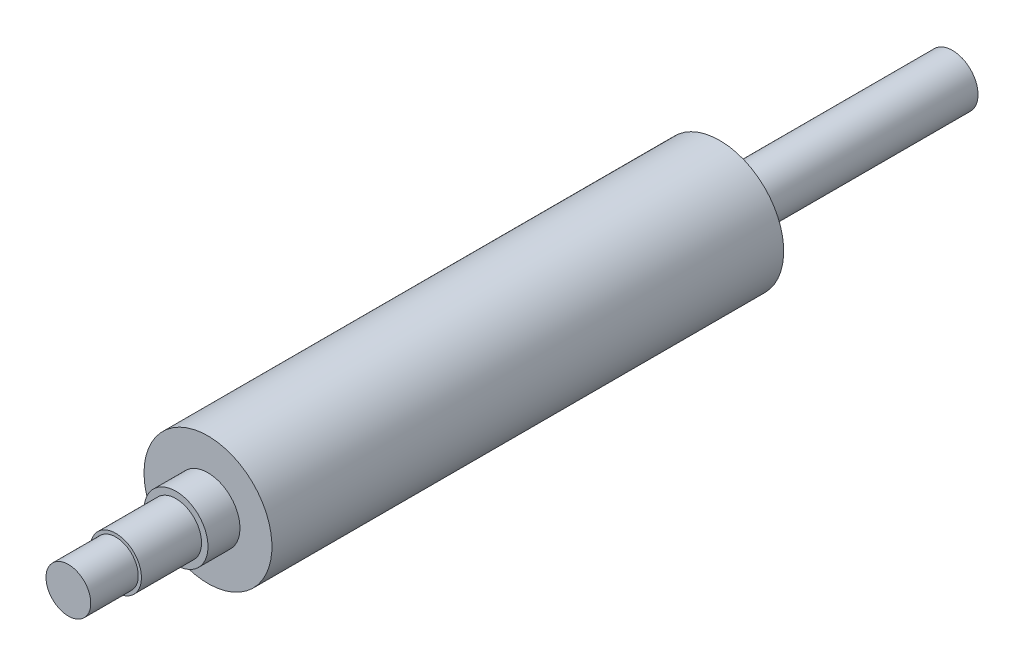
ISO-10303-21;
HEADER;
FILE_DESCRIPTION(('STEP AP214'),'2;1');
FILE_NAME('part.step','',(''),(''),'','','');
FILE_SCHEMA(('AUTOMOTIVE_DESIGN { 1 0 10303 214 1 1 1 1 }'));
ENDSEC;
DATA;
#1=APPLICATION_CONTEXT('core data for automotive mechanical design processes');
#2=APPLICATION_PROTOCOL_DEFINITION('international standard','automotive_design',2000,#1);
#3=PRODUCT_CONTEXT('',#1,'mechanical');
#4=PRODUCT('Part','Part','',(#3));
#5=PRODUCT_RELATED_PRODUCT_CATEGORY('part','',(#4));
#6=PRODUCT_DEFINITION_FORMATION('','',#4);
#7=PRODUCT_DEFINITION_CONTEXT('part definition',#1,'design');
#8=PRODUCT_DEFINITION('design','',#6,#7);
#9=PRODUCT_DEFINITION_SHAPE('','',#8);
#10=(LENGTH_UNIT() NAMED_UNIT(*) SI_UNIT(.MILLI.,.METRE.));
#11=(NAMED_UNIT(*) PLANE_ANGLE_UNIT() SI_UNIT($,.RADIAN.));
#12=(NAMED_UNIT(*) SI_UNIT($,.STERADIAN.) SOLID_ANGLE_UNIT());
#13=UNCERTAINTY_MEASURE_WITH_UNIT(LENGTH_MEASURE(1.E-05),#10,'distance_accuracy_value','');
#14=(GEOMETRIC_REPRESENTATION_CONTEXT(3) GLOBAL_UNCERTAINTY_ASSIGNED_CONTEXT((#13)) GLOBAL_UNIT_ASSIGNED_CONTEXT((#10,
#11,#12)) REPRESENTATION_CONTEXT('',''));
#15=CARTESIAN_POINT('',(0.,0.,0.));
#16=DIRECTION('',(0.,0.,1.));
#17=DIRECTION('',(1.,0.,0.));
#18=AXIS2_PLACEMENT_3D('',#15,#16,#17);
#19=CARTESIAN_POINT('',(4.,0.,0.));
#20=DIRECTION('',(0.,0.,1.));
#21=DIRECTION('',(1.,0.,0.));
#22=AXIS2_PLACEMENT_3D('',#19,#20,#21);
#23=PLANE('',#22);
#24=CARTESIAN_POINT('',(0.,0.,0.));
#25=DIRECTION('',(0.,0.,-1.));
#26=DIRECTION('',(-1.,0.,0.));
#27=AXIS2_PLACEMENT_3D('',#24,#25,#26);
#28=CIRCLE('',#27,4.);
#29=CARTESIAN_POINT('',(-4.,0.,0.));
#30=VERTEX_POINT('',#29);
#31=EDGE_CURVE('E88',#30,#30,#28,.T.);
#32=ORIENTED_EDGE('',*,*,#31,.T.);
#33=EDGE_LOOP('',(#32));
#34=FACE_BOUND('',#33,.T.);
#35=ADVANCED_FACE('F37',(#34),#23,.F.);
#36=CARTESIAN_POINT('',(0.,0.,138.2));
#37=DIRECTION('',(0.,0.,-1.));
#38=DIRECTION('',(-1.,0.,0.));
#39=AXIS2_PLACEMENT_3D('',#36,#37,#38);
#40=PLANE('',#39);
#41=CARTESIAN_POINT('',(0.,0.,138.2));
#42=DIRECTION('',(0.,0.,-1.));
#43=DIRECTION('',(-1.,0.,0.));
#44=AXIS2_PLACEMENT_3D('',#41,#42,#43);
#45=CIRCLE('',#44,3.50000000000002);
#46=CARTESIAN_POINT('',(-3.50000000000002,0.,138.2));
#47=VERTEX_POINT('',#46);
#48=EDGE_CURVE('E10',#47,#47,#45,.T.);
#49=ORIENTED_EDGE('',*,*,#48,.F.);
#50=EDGE_LOOP('',(#49));
#51=FACE_BOUND('',#50,.T.);
#52=ADVANCED_FACE('F155',(#51),#40,.F.);
#53=CARTESIAN_POINT('',(0.,0.,0.));
#54=DIRECTION('',(0.,0.,-1.));
#55=DIRECTION('',(-1.,0.,0.));
#56=AXIS2_PLACEMENT_3D('',#53,#54,#55);
#57=CYLINDRICAL_SURFACE('',#56,3.50000000000002);
#58=CARTESIAN_POINT('',(0.,0.,130.78));
#59=DIRECTION('',(0.,0.,-1.));
#60=DIRECTION('',(-1.,0.,0.));
#61=AXIS2_PLACEMENT_3D('',#58,#59,#60);
#62=CIRCLE('',#61,3.50000000000002);
#63=CARTESIAN_POINT('',(-3.50000000000002,0.,130.78));
#64=VERTEX_POINT('',#63);
#65=EDGE_CURVE('E44',#64,#64,#62,.T.);
#66=ORIENTED_EDGE('',*,*,#65,.F.);
#67=EDGE_LOOP('',(#66));
#68=FACE_BOUND('',#67,.T.);
#69=ORIENTED_EDGE('',*,*,#48,.T.);
#70=EDGE_LOOP('',(#69));
#71=FACE_BOUND('',#70,.T.);
#72=ADVANCED_FACE('F150',(#68,#71),#57,.T.);
#73=CARTESIAN_POINT('',(3.50000000000002,0.,130.78));
#74=DIRECTION('',(0.,0.,-1.));
#75=DIRECTION('',(-1.,0.,0.));
#76=AXIS2_PLACEMENT_3D('',#73,#74,#75);
#77=PLANE('',#76);
#78=CARTESIAN_POINT('',(0.,0.,130.78));
#79=DIRECTION('',(0.,0.,-1.));
#80=DIRECTION('',(-1.,0.,0.));
#81=AXIS2_PLACEMENT_3D('',#78,#79,#80);
#82=CIRCLE('',#81,4.00000000000002);
#83=CARTESIAN_POINT('',(-4.00000000000002,0.,130.78));
#84=VERTEX_POINT('',#83);
#85=EDGE_CURVE('E49',#84,#84,#82,.T.);
#86=ORIENTED_EDGE('',*,*,#85,.F.);
#87=EDGE_LOOP('',(#86));
#88=FACE_BOUND('',#87,.T.);
#89=ORIENTED_EDGE('',*,*,#65,.T.);
#90=EDGE_LOOP('',(#89));
#91=FACE_BOUND('',#90,.T.);
#92=ADVANCED_FACE('F145',(#88,#91),#77,.F.);
#93=CARTESIAN_POINT('',(0.,0.,0.));
#94=DIRECTION('',(0.,0.,-1.));
#95=DIRECTION('',(-1.,0.,0.));
#96=AXIS2_PLACEMENT_3D('',#93,#94,#95);
#97=CYLINDRICAL_SURFACE('',#96,4.00000000000002);
#98=CARTESIAN_POINT('',(0.,0.,121.38));
#99=DIRECTION('',(0.,0.,-1.));
#100=DIRECTION('',(-1.,0.,0.));
#101=AXIS2_PLACEMENT_3D('',#98,#99,#100);
#102=CIRCLE('',#101,4.00000000000002);
#103=CARTESIAN_POINT('',(-4.00000000000002,0.,121.38));
#104=VERTEX_POINT('',#103);
#105=EDGE_CURVE('E54',#104,#104,#102,.T.);
#106=ORIENTED_EDGE('',*,*,#105,.F.);
#107=EDGE_LOOP('',(#106));
#108=FACE_BOUND('',#107,.T.);
#109=ORIENTED_EDGE('',*,*,#85,.T.);
#110=EDGE_LOOP('',(#109));
#111=FACE_BOUND('',#110,.T.);
#112=ADVANCED_FACE('F139',(#108,#111),#97,.T.);
#113=CARTESIAN_POINT('',(4.00000000000002,0.,121.38));
#114=DIRECTION('',(0.,0.,-1.));
#115=DIRECTION('',(-1.,0.,0.));
#116=AXIS2_PLACEMENT_3D('',#113,#114,#115);
#117=PLANE('',#116);
#118=CARTESIAN_POINT('',(0.,0.,121.38));
#119=DIRECTION('',(0.,0.,-1.));
#120=DIRECTION('',(-1.,0.,0.));
#121=AXIS2_PLACEMENT_3D('',#118,#119,#120);
#122=CIRCLE('',#121,5.00000000000002);
#123=CARTESIAN_POINT('',(-5.00000000000002,0.,121.38));
#124=VERTEX_POINT('',#123);
#125=EDGE_CURVE('E60',#124,#124,#122,.T.);
#126=ORIENTED_EDGE('',*,*,#125,.F.);
#127=EDGE_LOOP('',(#126));
#128=FACE_BOUND('',#127,.T.);
#129=ORIENTED_EDGE('',*,*,#105,.T.);
#130=EDGE_LOOP('',(#129));
#131=FACE_BOUND('',#130,.T.);
#132=ADVANCED_FACE('F133',(#128,#131),#117,.F.);
#133=CARTESIAN_POINT('',(0.,0.,0.));
#134=DIRECTION('',(0.,0.,-1.));
#135=DIRECTION('',(-1.,0.,0.));
#136=AXIS2_PLACEMENT_3D('',#133,#134,#135);
#137=CYLINDRICAL_SURFACE('',#136,5.00000000000002);
#138=CARTESIAN_POINT('',(0.,0.,116.38));
#139=DIRECTION('',(0.,0.,-1.));
#140=DIRECTION('',(-1.,0.,0.));
#141=AXIS2_PLACEMENT_3D('',#138,#139,#140);
#142=CIRCLE('',#141,5.00000000000002);
#143=CARTESIAN_POINT('',(-5.00000000000002,0.,116.38));
#144=VERTEX_POINT('',#143);
#145=EDGE_CURVE('E64',#144,#144,#142,.T.);
#146=ORIENTED_EDGE('',*,*,#145,.F.);
#147=EDGE_LOOP('',(#146));
#148=FACE_BOUND('',#147,.T.);
#149=ORIENTED_EDGE('',*,*,#125,.T.);
#150=EDGE_LOOP('',(#149));
#151=FACE_BOUND('',#150,.T.);
#152=ADVANCED_FACE('F127',(#148,#151),#137,.T.);
#153=CARTESIAN_POINT('',(5.00000000000002,0.,116.38));
#154=DIRECTION('',(0.,0.,-1.));
#155=DIRECTION('',(-1.,0.,0.));
#156=AXIS2_PLACEMENT_3D('',#153,#154,#155);
#157=PLANE('',#156);
#158=CARTESIAN_POINT('',(0.,0.,116.38));
#159=DIRECTION('',(0.,0.,-1.));
#160=DIRECTION('',(-1.,0.,0.));
#161=AXIS2_PLACEMENT_3D('',#158,#159,#160);
#162=CIRCLE('',#161,10.);
#163=CARTESIAN_POINT('',(-10.,0.,116.38));
#164=VERTEX_POINT('',#163);
#165=EDGE_CURVE('E68',#164,#164,#162,.T.);
#166=ORIENTED_EDGE('',*,*,#165,.F.);
#167=EDGE_LOOP('',(#166));
#168=FACE_BOUND('',#167,.T.);
#169=ORIENTED_EDGE('',*,*,#145,.T.);
#170=EDGE_LOOP('',(#169));
#171=FACE_BOUND('',#170,.T.);
#172=ADVANCED_FACE('F121',(#168,#171),#157,.F.);
#173=CARTESIAN_POINT('',(0.,0.,0.));
#174=DIRECTION('',(0.,0.,-1.));
#175=DIRECTION('',(-1.,0.,0.));
#176=AXIS2_PLACEMENT_3D('',#173,#174,#175);
#177=CYLINDRICAL_SURFACE('',#176,10.);
#178=CARTESIAN_POINT('',(0.,0.,36.38));
#179=DIRECTION('',(0.,0.,-1.));
#180=DIRECTION('',(-1.,0.,0.));
#181=AXIS2_PLACEMENT_3D('',#178,#179,#180);
#182=CIRCLE('',#181,10.);
#183=CARTESIAN_POINT('',(-10.,0.,36.38));
#184=VERTEX_POINT('',#183);
#185=EDGE_CURVE('E72',#184,#184,#182,.T.);
#186=ORIENTED_EDGE('',*,*,#185,.F.);
#187=EDGE_LOOP('',(#186));
#188=FACE_BOUND('',#187,.T.);
#189=ORIENTED_EDGE('',*,*,#165,.T.);
#190=EDGE_LOOP('',(#189));
#191=FACE_BOUND('',#190,.T.);
#192=ADVANCED_FACE('F115',(#188,#191),#177,.T.);
#193=CARTESIAN_POINT('',(10.,0.,36.38));
#194=DIRECTION('',(0.,0.,1.));
#195=DIRECTION('',(1.,0.,0.));
#196=AXIS2_PLACEMENT_3D('',#193,#194,#195);
#197=PLANE('',#196);
#198=CARTESIAN_POINT('',(0.,0.,36.38));
#199=DIRECTION('',(0.,0.,-1.));
#200=DIRECTION('',(-1.,0.,0.));
#201=AXIS2_PLACEMENT_3D('',#198,#199,#200);
#202=CIRCLE('',#201,5.00000000000002);
#203=CARTESIAN_POINT('',(-5.00000000000002,0.,36.38));
#204=VERTEX_POINT('',#203);
#205=EDGE_CURVE('E76',#204,#204,#202,.T.);
#206=ORIENTED_EDGE('',*,*,#205,.F.);
#207=EDGE_LOOP('',(#206));
#208=FACE_BOUND('',#207,.T.);
#209=ORIENTED_EDGE('',*,*,#185,.T.);
#210=EDGE_LOOP('',(#209));
#211=FACE_BOUND('',#210,.T.);
#212=ADVANCED_FACE('F109',(#208,#211),#197,.F.);
#213=CARTESIAN_POINT('',(0.,0.,0.));
#214=DIRECTION('',(0.,0.,-1.));
#215=DIRECTION('',(-1.,0.,0.));
#216=AXIS2_PLACEMENT_3D('',#213,#214,#215);
#217=CYLINDRICAL_SURFACE('',#216,5.00000000000002);
#218=CARTESIAN_POINT('',(0.,0.,32.88));
#219=DIRECTION('',(0.,0.,-1.));
#220=DIRECTION('',(-1.,0.,0.));
#221=AXIS2_PLACEMENT_3D('',#218,#219,#220);
#222=CIRCLE('',#221,5.00000000000002);
#223=CARTESIAN_POINT('',(-5.00000000000002,0.,32.88));
#224=VERTEX_POINT('',#223);
#225=EDGE_CURVE('E80',#224,#224,#222,.T.);
#226=ORIENTED_EDGE('',*,*,#225,.F.);
#227=EDGE_LOOP('',(#226));
#228=FACE_BOUND('',#227,.T.);
#229=ORIENTED_EDGE('',*,*,#205,.T.);
#230=EDGE_LOOP('',(#229));
#231=FACE_BOUND('',#230,.T.);
#232=ADVANCED_FACE('F103',(#228,#231),#217,.T.);
#233=CARTESIAN_POINT('',(5.00000000000002,0.,32.88));
#234=DIRECTION('',(0.,0.,1.));
#235=DIRECTION('',(1.,0.,0.));
#236=AXIS2_PLACEMENT_3D('',#233,#234,#235);
#237=PLANE('',#236);
#238=CARTESIAN_POINT('',(0.,0.,32.88));
#239=DIRECTION('',(0.,0.,-1.));
#240=DIRECTION('',(-1.,0.,0.));
#241=AXIS2_PLACEMENT_3D('',#238,#239,#240);
#242=CIRCLE('',#241,4.);
#243=CARTESIAN_POINT('',(-4.,0.,32.88));
#244=VERTEX_POINT('',#243);
#245=EDGE_CURVE('E84',#244,#244,#242,.T.);
#246=ORIENTED_EDGE('',*,*,#245,.F.);
#247=EDGE_LOOP('',(#246));
#248=FACE_BOUND('',#247,.T.);
#249=ORIENTED_EDGE('',*,*,#225,.T.);
#250=EDGE_LOOP('',(#249));
#251=FACE_BOUND('',#250,.T.);
#252=ADVANCED_FACE('F97',(#248,#251),#237,.F.);
#253=CARTESIAN_POINT('',(0.,0.,0.));
#254=DIRECTION('',(0.,0.,-1.));
#255=DIRECTION('',(-1.,0.,0.));
#256=AXIS2_PLACEMENT_3D('',#253,#254,#255);
#257=CYLINDRICAL_SURFACE('',#256,4.);
#258=ORIENTED_EDGE('',*,*,#31,.F.);
#259=EDGE_LOOP('',(#258));
#260=FACE_BOUND('',#259,.T.);
#261=ORIENTED_EDGE('',*,*,#245,.T.);
#262=EDGE_LOOP('',(#261));
#263=FACE_BOUND('',#262,.T.);
#264=ADVANCED_FACE('F94',(#260,#263),#257,.T.);
#265=CLOSED_SHELL('',(#35,#52,#72,#92,#112,#132,#152,#172,#192,#212,#232,#252,#264));
#266=MANIFOLD_SOLID_BREP('B2',#265);
#267=ADVANCED_BREP_SHAPE_REPRESENTATION('',(#18,#266),#14);
#268=SHAPE_DEFINITION_REPRESENTATION(#9,#267);
ENDSEC;
END-ISO-10303-21;
